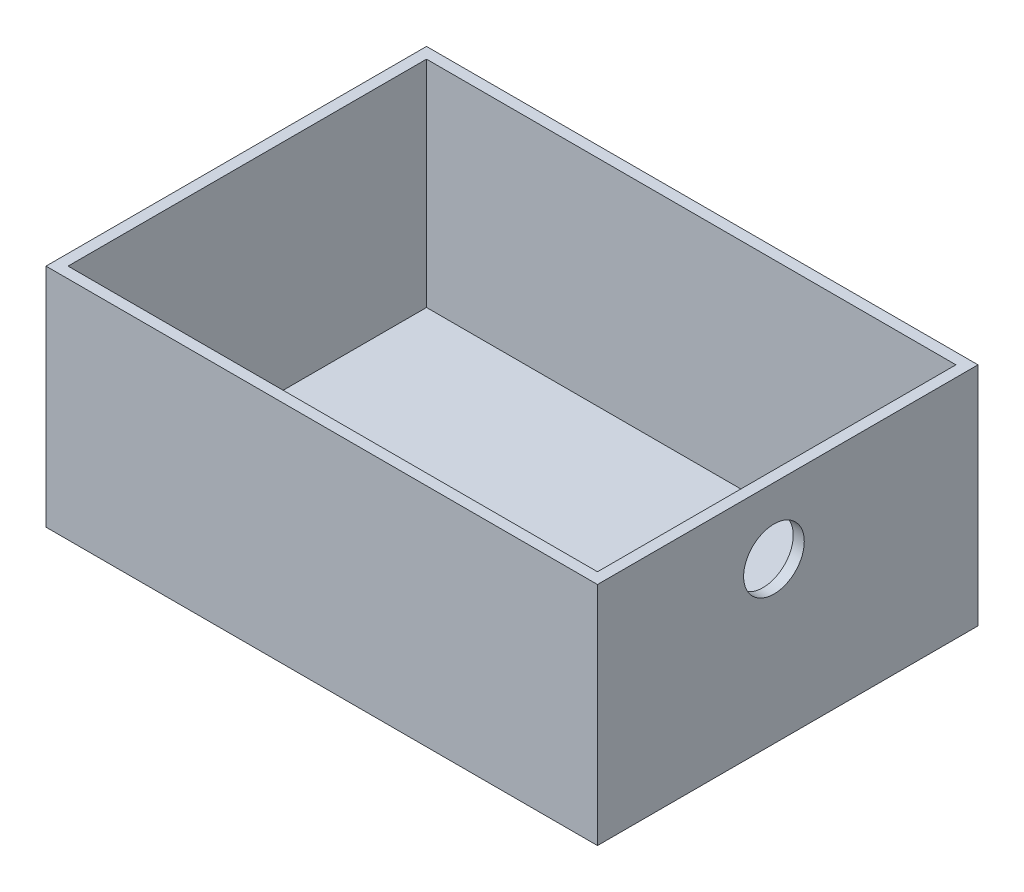
ISO-10303-21;
HEADER;
FILE_DESCRIPTION(('STEP AP214'),'2;1');
FILE_NAME('part.step','',(''),(''),'','','');
FILE_SCHEMA(('AUTOMOTIVE_DESIGN { 1 0 10303 214 1 1 1 1 }'));
ENDSEC;
DATA;
#1=APPLICATION_CONTEXT('core data for automotive mechanical design processes');
#2=APPLICATION_PROTOCOL_DEFINITION('international standard','automotive_design',2000,#1);
#3=PRODUCT_CONTEXT('',#1,'mechanical');
#4=PRODUCT('Part','Part','',(#3));
#5=PRODUCT_RELATED_PRODUCT_CATEGORY('part','',(#4));
#6=PRODUCT_DEFINITION_FORMATION('','',#4);
#7=PRODUCT_DEFINITION_CONTEXT('part definition',#1,'design');
#8=PRODUCT_DEFINITION('design','',#6,#7);
#9=PRODUCT_DEFINITION_SHAPE('','',#8);
#10=(LENGTH_UNIT() NAMED_UNIT(*) SI_UNIT(.MILLI.,.METRE.));
#11=(NAMED_UNIT(*) PLANE_ANGLE_UNIT() SI_UNIT($,.RADIAN.));
#12=(NAMED_UNIT(*) SI_UNIT($,.STERADIAN.) SOLID_ANGLE_UNIT());
#13=UNCERTAINTY_MEASURE_WITH_UNIT(LENGTH_MEASURE(1.E-05),#10,'distance_accuracy_value','');
#14=(GEOMETRIC_REPRESENTATION_CONTEXT(3) GLOBAL_UNCERTAINTY_ASSIGNED_CONTEXT((#13)) GLOBAL_UNIT_ASSIGNED_CONTEXT((#10,
#11,#12)) REPRESENTATION_CONTEXT('',''));
#15=CARTESIAN_POINT('',(0.,0.,0.));
#16=DIRECTION('',(0.,0.,1.));
#17=DIRECTION('',(1.,0.,0.));
#18=AXIS2_PLACEMENT_3D('',#15,#16,#17);
#19=CARTESIAN_POINT('',(-50.,41.,34.5));
#20=DIRECTION('',(0.,0.,-1.));
#21=DIRECTION('',(-1.,0.,0.));
#22=AXIS2_PLACEMENT_3D('',#19,#20,#21);
#23=PLANE('',#22);
#24=DIRECTION('',(1.,0.,0.));
#25=VECTOR('',#24,1.);
#26=CARTESIAN_POINT('',(-50.,0.,34.5));
#27=LINE('',#26,#25);
#28=CARTESIAN_POINT('',(-50.,0.,34.5));
#29=VERTEX_POINT('',#28);
#30=CARTESIAN_POINT('',(50.,0.,34.5));
#31=VERTEX_POINT('',#30);
#32=EDGE_CURVE('E201',#29,#31,#27,.T.);
#33=ORIENTED_EDGE('',*,*,#32,.T.);
#34=DIRECTION('',(0.,-1.,0.));
#35=VECTOR('',#34,1.);
#36=CARTESIAN_POINT('',(50.,41.,34.5));
#37=LINE('',#36,#35);
#38=CARTESIAN_POINT('',(50.,41.,34.5));
#39=VERTEX_POINT('',#38);
#40=EDGE_CURVE('E11',#39,#31,#37,.T.);
#41=ORIENTED_EDGE('',*,*,#40,.F.);
#42=DIRECTION('',(1.,0.,0.));
#43=VECTOR('',#42,1.);
#44=CARTESIAN_POINT('',(-50.,41.,34.5));
#45=LINE('',#44,#43);
#46=CARTESIAN_POINT('',(-50.,41.,34.5));
#47=VERTEX_POINT('',#46);
#48=EDGE_CURVE('E210',#47,#39,#45,.T.);
#49=ORIENTED_EDGE('',*,*,#48,.F.);
#50=DIRECTION('',(0.,-1.,0.));
#51=VECTOR('',#50,1.);
#52=CARTESIAN_POINT('',(-50.,41.,34.5));
#53=LINE('',#52,#51);
#54=EDGE_CURVE('E226',#47,#29,#53,.T.);
#55=ORIENTED_EDGE('',*,*,#54,.T.);
#56=EDGE_LOOP('',(#33,#41,#49,#55));
#57=FACE_BOUND('',#56,.T.);
#58=ADVANCED_FACE('F45',(#57),#23,.F.);
#59=CARTESIAN_POINT('',(50.,41.,34.5));
#60=DIRECTION('',(-1.,0.,0.));
#61=DIRECTION('',(0.,0.,1.));
#62=AXIS2_PLACEMENT_3D('',#59,#60,#61);
#63=PLANE('',#62);
#64=CARTESIAN_POINT('',(50.,29.,2.5));
#65=DIRECTION('',(1.,0.,0.));
#66=DIRECTION('',(0.,0.,-1.));
#67=AXIS2_PLACEMENT_3D('',#64,#65,#66);
#68=CIRCLE('',#67,5.5);
#69=CARTESIAN_POINT('',(50.,29.,-3.));
#70=VERTEX_POINT('',#69);
#71=EDGE_CURVE('E151',#70,#70,#68,.T.);
#72=ORIENTED_EDGE('',*,*,#71,.F.);
#73=EDGE_LOOP('',(#72));
#74=FACE_BOUND('',#73,.T.);
#75=DIRECTION('',(0.,0.,-1.));
#76=VECTOR('',#75,1.);
#77=CARTESIAN_POINT('',(50.,0.,34.5));
#78=LINE('',#77,#76);
#79=CARTESIAN_POINT('',(50.,0.,-34.5));
#80=VERTEX_POINT('',#79);
#81=EDGE_CURVE('E230',#31,#80,#78,.T.);
#82=ORIENTED_EDGE('',*,*,#81,.T.);
#83=DIRECTION('',(0.,-1.,0.));
#84=VECTOR('',#83,1.);
#85=CARTESIAN_POINT('',(50.,41.,-34.5));
#86=LINE('',#85,#84);
#87=CARTESIAN_POINT('',(50.,41.,-34.5));
#88=VERTEX_POINT('',#87);
#89=EDGE_CURVE('E53',#88,#80,#86,.T.);
#90=ORIENTED_EDGE('',*,*,#89,.F.);
#91=DIRECTION('',(0.,0.,-1.));
#92=VECTOR('',#91,1.);
#93=CARTESIAN_POINT('',(50.,41.,34.5));
#94=LINE('',#93,#92);
#95=EDGE_CURVE('E214',#39,#88,#94,.T.);
#96=ORIENTED_EDGE('',*,*,#95,.F.);
#97=ORIENTED_EDGE('',*,*,#40,.T.);
#98=EDGE_LOOP('',(#82,#90,#96,#97));
#99=FACE_BOUND('',#98,.T.);
#100=ADVANCED_FACE('F253',(#74,#99),#63,.F.);
#101=CARTESIAN_POINT('',(-50.,41.,-34.5));
#102=DIRECTION('',(0.,0.,-1.));
#103=DIRECTION('',(-1.,0.,0.));
#104=AXIS2_PLACEMENT_3D('',#101,#102,#103);
#105=PLANE('',#104);
#106=DIRECTION('',(-1.,0.,0.));
#107=VECTOR('',#106,1.);
#108=CARTESIAN_POINT('',(48.,2.,-34.5));
#109=LINE('',#108,#107);
#110=CARTESIAN_POINT('',(48.,2.,-34.5));
#111=VERTEX_POINT('',#110);
#112=CARTESIAN_POINT('',(42.,2.,-34.5));
#113=VERTEX_POINT('',#112);
#114=EDGE_CURVE('E144',#111,#113,#109,.T.);
#115=ORIENTED_EDGE('',*,*,#114,.F.);
#116=DIRECTION('',(0.,-1.,0.));
#117=VECTOR('',#116,1.);
#118=CARTESIAN_POINT('',(48.,8.,-34.5));
#119=LINE('',#118,#117);
#120=CARTESIAN_POINT('',(48.,8.,-34.5));
#121=VERTEX_POINT('',#120);
#122=EDGE_CURVE('E148',#121,#111,#119,.T.);
#123=ORIENTED_EDGE('',*,*,#122,.F.);
#124=DIRECTION('',(1.,0.,0.));
#125=VECTOR('',#124,1.);
#126=CARTESIAN_POINT('',(48.,8.,-34.5));
#127=LINE('',#126,#125);
#128=CARTESIAN_POINT('',(42.,8.,-34.5));
#129=VERTEX_POINT('',#128);
#130=EDGE_CURVE('E156',#129,#121,#127,.T.);
#131=ORIENTED_EDGE('',*,*,#130,.F.);
#132=DIRECTION('',(0.,1.,0.));
#133=VECTOR('',#132,1.);
#134=CARTESIAN_POINT('',(42.,8.,-34.5));
#135=LINE('',#134,#133);
#136=EDGE_CURVE('E60',#113,#129,#135,.T.);
#137=ORIENTED_EDGE('',*,*,#136,.F.);
#138=EDGE_LOOP('',(#115,#123,#131,#137));
#139=FACE_BOUND('',#138,.T.);
#140=ORIENTED_EDGE('',*,*,#89,.T.);
#141=DIRECTION('',(1.,0.,0.));
#142=VECTOR('',#141,1.);
#143=CARTESIAN_POINT('',(-50.,0.,-34.5));
#144=LINE('',#143,#142);
#145=CARTESIAN_POINT('',(-50.,0.,-34.5));
#146=VERTEX_POINT('',#145);
#147=EDGE_CURVE('E234',#146,#80,#144,.T.);
#148=ORIENTED_EDGE('',*,*,#147,.F.);
#149=DIRECTION('',(0.,-1.,0.));
#150=VECTOR('',#149,1.);
#151=CARTESIAN_POINT('',(-50.,41.,-34.5));
#152=LINE('',#151,#150);
#153=CARTESIAN_POINT('',(-50.,41.,-34.5));
#154=VERTEX_POINT('',#153);
#155=EDGE_CURVE('E243',#154,#146,#152,.T.);
#156=ORIENTED_EDGE('',*,*,#155,.F.);
#157=DIRECTION('',(1.,0.,0.));
#158=VECTOR('',#157,1.);
#159=CARTESIAN_POINT('',(-50.,41.,-34.5));
#160=LINE('',#159,#158);
#161=EDGE_CURVE('E218',#154,#88,#160,.T.);
#162=ORIENTED_EDGE('',*,*,#161,.T.);
#163=EDGE_LOOP('',(#140,#148,#156,#162));
#164=FACE_BOUND('',#163,.T.);
#165=ADVANCED_FACE('F249',(#139,#164),#105,.T.);
#166=CARTESIAN_POINT('',(-50.,41.,34.5));
#167=DIRECTION('',(-1.,0.,0.));
#168=DIRECTION('',(0.,0.,1.));
#169=AXIS2_PLACEMENT_3D('',#166,#167,#168);
#170=PLANE('',#169);
#171=DIRECTION('',(0.,0.,-1.));
#172=VECTOR('',#171,1.);
#173=CARTESIAN_POINT('',(-50.,0.,34.5));
#174=LINE('',#173,#172);
#175=EDGE_CURVE('E215',#29,#146,#174,.T.);
#176=ORIENTED_EDGE('',*,*,#175,.F.);
#177=ORIENTED_EDGE('',*,*,#54,.F.);
#178=DIRECTION('',(0.,0.,-1.));
#179=VECTOR('',#178,1.);
#180=CARTESIAN_POINT('',(-50.,41.,34.5));
#181=LINE('',#180,#179);
#182=EDGE_CURVE('E222',#47,#154,#181,.T.);
#183=ORIENTED_EDGE('',*,*,#182,.T.);
#184=ORIENTED_EDGE('',*,*,#155,.T.);
#185=EDGE_LOOP('',(#176,#177,#183,#184));
#186=FACE_BOUND('',#185,.T.);
#187=ADVANCED_FACE('F260',(#186),#170,.T.);
#188=CARTESIAN_POINT('',(0.,41.,0.));
#189=DIRECTION('',(0.,1.,0.));
#190=DIRECTION('',(0.,0.,1.));
#191=AXIS2_PLACEMENT_3D('',#188,#189,#190);
#192=PLANE('',#191);
#193=DIRECTION('',(0.,0.,-1.));
#194=VECTOR('',#193,1.);
#195=CARTESIAN_POINT('',(48.,41.,32.5));
#196=LINE('',#195,#194);
#197=CARTESIAN_POINT('',(48.,41.,32.5));
#198=VERTEX_POINT('',#197);
#199=CARTESIAN_POINT('',(48.,41.,-32.5));
#200=VERTEX_POINT('',#199);
#201=EDGE_CURVE('E166',#198,#200,#196,.T.);
#202=ORIENTED_EDGE('',*,*,#201,.F.);
#203=DIRECTION('',(1.,0.,0.));
#204=VECTOR('',#203,1.);
#205=CARTESIAN_POINT('',(-48.,41.,32.5));
#206=LINE('',#205,#204);
#207=CARTESIAN_POINT('',(-48.,41.,32.5));
#208=VERTEX_POINT('',#207);
#209=EDGE_CURVE('E172',#208,#198,#206,.T.);
#210=ORIENTED_EDGE('',*,*,#209,.F.);
#211=DIRECTION('',(0.,0.,1.));
#212=VECTOR('',#211,1.);
#213=CARTESIAN_POINT('',(-48.,41.,32.5));
#214=LINE('',#213,#212);
#215=CARTESIAN_POINT('',(-48.,41.,-32.5));
#216=VERTEX_POINT('',#215);
#217=EDGE_CURVE('E191',#216,#208,#214,.T.);
#218=ORIENTED_EDGE('',*,*,#217,.F.);
#219=DIRECTION('',(-1.,0.,0.));
#220=VECTOR('',#219,1.);
#221=CARTESIAN_POINT('',(-48.,41.,-32.5));
#222=LINE('',#221,#220);
#223=EDGE_CURVE('E187',#200,#216,#222,.T.);
#224=ORIENTED_EDGE('',*,*,#223,.F.);
#225=EDGE_LOOP('',(#202,#210,#218,#224));
#226=FACE_BOUND('',#225,.T.);
#227=ORIENTED_EDGE('',*,*,#48,.T.);
#228=ORIENTED_EDGE('',*,*,#95,.T.);
#229=ORIENTED_EDGE('',*,*,#161,.F.);
#230=ORIENTED_EDGE('',*,*,#182,.F.);
#231=EDGE_LOOP('',(#227,#228,#229,#230));
#232=FACE_BOUND('',#231,.T.);
#233=ADVANCED_FACE('F264',(#226,#232),#192,.T.);
#234=CARTESIAN_POINT('',(0.,0.,0.));
#235=DIRECTION('',(0.,1.,0.));
#236=DIRECTION('',(0.,0.,1.));
#237=AXIS2_PLACEMENT_3D('',#234,#235,#236);
#238=PLANE('',#237);
#239=ORIENTED_EDGE('',*,*,#32,.F.);
#240=ORIENTED_EDGE('',*,*,#175,.T.);
#241=ORIENTED_EDGE('',*,*,#147,.T.);
#242=ORIENTED_EDGE('',*,*,#81,.F.);
#243=EDGE_LOOP('',(#239,#240,#241,#242));
#244=FACE_BOUND('',#243,.T.);
#245=ADVANCED_FACE('F257',(#244),#238,.F.);
#246=CARTESIAN_POINT('',(48.,2.,32.5));
#247=DIRECTION('',(1.,0.,0.));
#248=DIRECTION('',(0.,0.,-1.));
#249=AXIS2_PLACEMENT_3D('',#246,#247,#248);
#250=PLANE('',#249);
#251=CARTESIAN_POINT('',(48.,29.,2.5));
#252=DIRECTION('',(1.,0.,0.));
#253=DIRECTION('',(0.,0.,-1.));
#254=AXIS2_PLACEMENT_3D('',#251,#252,#253);
#255=CIRCLE('',#254,5.5);
#256=CARTESIAN_POINT('',(48.,29.,-3.));
#257=VERTEX_POINT('',#256);
#258=EDGE_CURVE('E157',#257,#257,#255,.T.);
#259=ORIENTED_EDGE('',*,*,#258,.T.);
#260=EDGE_LOOP('',(#259));
#261=FACE_BOUND('',#260,.T.);
#262=ORIENTED_EDGE('',*,*,#201,.T.);
#263=DIRECTION('',(0.,1.,0.));
#264=VECTOR('',#263,1.);
#265=CARTESIAN_POINT('',(48.,2.,-32.5));
#266=LINE('',#265,#264);
#267=CARTESIAN_POINT('',(48.,8.,-32.5));
#268=VERTEX_POINT('',#267);
#269=EDGE_CURVE('E183',#268,#200,#266,.T.);
#270=ORIENTED_EDGE('',*,*,#269,.F.);
#271=DIRECTION('',(0.,0.,-1.));
#272=VECTOR('',#271,1.);
#273=CARTESIAN_POINT('',(48.,8.,-32.5));
#274=LINE('',#273,#272);
#275=EDGE_CURVE('E130',#268,#121,#274,.T.);
#276=ORIENTED_EDGE('',*,*,#275,.T.);
#277=ORIENTED_EDGE('',*,*,#122,.T.);
#278=DIRECTION('',(0.,0.,-1.));
#279=VECTOR('',#278,1.);
#280=CARTESIAN_POINT('',(48.,2.,32.5));
#281=LINE('',#280,#279);
#282=CARTESIAN_POINT('',(48.,2.,32.5));
#283=VERTEX_POINT('',#282);
#284=EDGE_CURVE('E169',#283,#111,#281,.T.);
#285=ORIENTED_EDGE('',*,*,#284,.F.);
#286=DIRECTION('',(0.,1.,0.));
#287=VECTOR('',#286,1.);
#288=CARTESIAN_POINT('',(48.,2.,32.5));
#289=LINE('',#288,#287);
#290=EDGE_CURVE('E198',#283,#198,#289,.T.);
#291=ORIENTED_EDGE('',*,*,#290,.T.);
#292=EDGE_LOOP('',(#262,#270,#276,#277,#285,#291));
#293=FACE_BOUND('',#292,.T.);
#294=ADVANCED_FACE('F284',(#261,#293),#250,.F.);
#295=CARTESIAN_POINT('',(-48.,2.,32.5));
#296=DIRECTION('',(0.,0.,1.));
#297=DIRECTION('',(1.,0.,0.));
#298=AXIS2_PLACEMENT_3D('',#295,#296,#297);
#299=PLANE('',#298);
#300=ORIENTED_EDGE('',*,*,#209,.T.);
#301=ORIENTED_EDGE('',*,*,#290,.F.);
#302=DIRECTION('',(1.,0.,0.));
#303=VECTOR('',#302,1.);
#304=CARTESIAN_POINT('',(-48.,2.,32.5));
#305=LINE('',#304,#303);
#306=CARTESIAN_POINT('',(-48.,2.,32.5));
#307=VERTEX_POINT('',#306);
#308=EDGE_CURVE('E179',#307,#283,#305,.T.);
#309=ORIENTED_EDGE('',*,*,#308,.F.);
#310=DIRECTION('',(0.,1.,0.));
#311=VECTOR('',#310,1.);
#312=CARTESIAN_POINT('',(-48.,2.,32.5));
#313=LINE('',#312,#311);
#314=EDGE_CURVE('E202',#307,#208,#313,.T.);
#315=ORIENTED_EDGE('',*,*,#314,.T.);
#316=EDGE_LOOP('',(#300,#301,#309,#315));
#317=FACE_BOUND('',#316,.T.);
#318=ADVANCED_FACE('F289',(#317),#299,.F.);
#319=CARTESIAN_POINT('',(-48.,2.,32.5));
#320=DIRECTION('',(-1.,0.,0.));
#321=DIRECTION('',(0.,0.,1.));
#322=AXIS2_PLACEMENT_3D('',#319,#320,#321);
#323=PLANE('',#322);
#324=ORIENTED_EDGE('',*,*,#217,.T.);
#325=ORIENTED_EDGE('',*,*,#314,.F.);
#326=DIRECTION('',(0.,0.,1.));
#327=VECTOR('',#326,1.);
#328=CARTESIAN_POINT('',(-48.,2.,32.5));
#329=LINE('',#328,#327);
#330=CARTESIAN_POINT('',(-48.,2.,-32.5));
#331=VERTEX_POINT('',#330);
#332=EDGE_CURVE('E175',#331,#307,#329,.T.);
#333=ORIENTED_EDGE('',*,*,#332,.F.);
#334=DIRECTION('',(0.,1.,0.));
#335=VECTOR('',#334,1.);
#336=CARTESIAN_POINT('',(-48.,2.,-32.5));
#337=LINE('',#336,#335);
#338=EDGE_CURVE('E205',#331,#216,#337,.T.);
#339=ORIENTED_EDGE('',*,*,#338,.T.);
#340=EDGE_LOOP('',(#324,#325,#333,#339));
#341=FACE_BOUND('',#340,.T.);
#342=ADVANCED_FACE('F294',(#341),#323,.F.);
#343=CARTESIAN_POINT('',(-48.,2.,-32.5));
#344=DIRECTION('',(0.,0.,-1.));
#345=DIRECTION('',(-1.,0.,0.));
#346=AXIS2_PLACEMENT_3D('',#343,#344,#345);
#347=PLANE('',#346);
#348=DIRECTION('',(-1.,0.,0.));
#349=VECTOR('',#348,1.);
#350=CARTESIAN_POINT('',(-48.,2.,-32.5));
#351=LINE('',#350,#349);
#352=CARTESIAN_POINT('',(42.,2.,-32.5));
#353=VERTEX_POINT('',#352);
#354=EDGE_CURVE('E142',#353,#331,#351,.T.);
#355=ORIENTED_EDGE('',*,*,#354,.F.);
#356=DIRECTION('',(0.,1.,0.));
#357=VECTOR('',#356,1.);
#358=CARTESIAN_POINT('',(42.,8.,-32.5));
#359=LINE('',#358,#357);
#360=CARTESIAN_POINT('',(42.,8.,-32.5));
#361=VERTEX_POINT('',#360);
#362=EDGE_CURVE('E65',#353,#361,#359,.T.);
#363=ORIENTED_EDGE('',*,*,#362,.T.);
#364=DIRECTION('',(1.,0.,0.));
#365=VECTOR('',#364,1.);
#366=CARTESIAN_POINT('',(48.,8.,-32.5));
#367=LINE('',#366,#365);
#368=EDGE_CURVE('E131',#361,#268,#367,.T.);
#369=ORIENTED_EDGE('',*,*,#368,.T.);
#370=ORIENTED_EDGE('',*,*,#269,.T.);
#371=ORIENTED_EDGE('',*,*,#223,.T.);
#372=ORIENTED_EDGE('',*,*,#338,.F.);
#373=EDGE_LOOP('',(#355,#363,#369,#370,#371,#372));
#374=FACE_BOUND('',#373,.T.);
#375=ADVANCED_FACE('F140',(#374),#347,.F.);
#376=CARTESIAN_POINT('',(0.,2.,0.));
#377=DIRECTION('',(0.,-1.,0.));
#378=DIRECTION('',(0.,0.,-1.));
#379=AXIS2_PLACEMENT_3D('',#376,#377,#378);
#380=PLANE('',#379);
#381=ORIENTED_EDGE('',*,*,#284,.T.);
#382=ORIENTED_EDGE('',*,*,#114,.T.);
#383=DIRECTION('',(0.,0.,-1.));
#384=VECTOR('',#383,1.);
#385=CARTESIAN_POINT('',(42.,2.,-32.5));
#386=LINE('',#385,#384);
#387=EDGE_CURVE('E163',#353,#113,#386,.T.);
#388=ORIENTED_EDGE('',*,*,#387,.F.);
#389=ORIENTED_EDGE('',*,*,#354,.T.);
#390=ORIENTED_EDGE('',*,*,#332,.T.);
#391=ORIENTED_EDGE('',*,*,#308,.T.);
#392=EDGE_LOOP('',(#381,#382,#388,#389,#390,#391));
#393=FACE_BOUND('',#392,.T.);
#394=ADVANCED_FACE('F293',(#393),#380,.F.);
#395=CARTESIAN_POINT('',(42.,8.,-32.5));
#396=DIRECTION('',(-1.,0.,0.));
#397=DIRECTION('',(0.,0.,1.));
#398=AXIS2_PLACEMENT_3D('',#395,#396,#397);
#399=PLANE('',#398);
#400=ORIENTED_EDGE('',*,*,#136,.T.);
#401=DIRECTION('',(0.,0.,-1.));
#402=VECTOR('',#401,1.);
#403=CARTESIAN_POINT('',(42.,8.,-32.5));
#404=LINE('',#403,#402);
#405=EDGE_CURVE('E123',#361,#129,#404,.T.);
#406=ORIENTED_EDGE('',*,*,#405,.F.);
#407=ORIENTED_EDGE('',*,*,#362,.F.);
#408=ORIENTED_EDGE('',*,*,#387,.T.);
#409=EDGE_LOOP('',(#400,#406,#407,#408));
#410=FACE_BOUND('',#409,.T.);
#411=ADVANCED_FACE('F125',(#410),#399,.F.);
#412=CARTESIAN_POINT('',(48.,8.,-32.5));
#413=DIRECTION('',(0.,1.,0.));
#414=DIRECTION('',(0.,0.,1.));
#415=AXIS2_PLACEMENT_3D('',#412,#413,#414);
#416=PLANE('',#415);
#417=ORIENTED_EDGE('',*,*,#130,.T.);
#418=ORIENTED_EDGE('',*,*,#275,.F.);
#419=ORIENTED_EDGE('',*,*,#368,.F.);
#420=ORIENTED_EDGE('',*,*,#405,.T.);
#421=EDGE_LOOP('',(#417,#418,#419,#420));
#422=FACE_BOUND('',#421,.T.);
#423=ADVANCED_FACE('F134',(#422),#416,.F.);
#424=CARTESIAN_POINT('',(48.,29.,2.5));
#425=DIRECTION('',(1.,0.,0.));
#426=DIRECTION('',(0.,0.,-1.));
#427=AXIS2_PLACEMENT_3D('',#424,#425,#426);
#428=CYLINDRICAL_SURFACE('',#427,5.5);
#429=ORIENTED_EDGE('',*,*,#258,.F.);
#430=EDGE_LOOP('',(#429));
#431=FACE_BOUND('',#430,.T.);
#432=ORIENTED_EDGE('',*,*,#71,.T.);
#433=EDGE_LOOP('',(#432));
#434=FACE_BOUND('',#433,.T.);
#435=ADVANCED_FACE('F307',(#431,#434),#428,.F.);
#436=CLOSED_SHELL('',(#58,#100,#165,#187,#233,#245,#294,#318,#342,#375,#394,#411,#423,#435));
#437=MANIFOLD_SOLID_BREP('B2',#436);
#438=ADVANCED_BREP_SHAPE_REPRESENTATION('',(#18,#437),#14);
#439=SHAPE_DEFINITION_REPRESENTATION(#9,#438);
ENDSEC;
END-ISO-10303-21;
